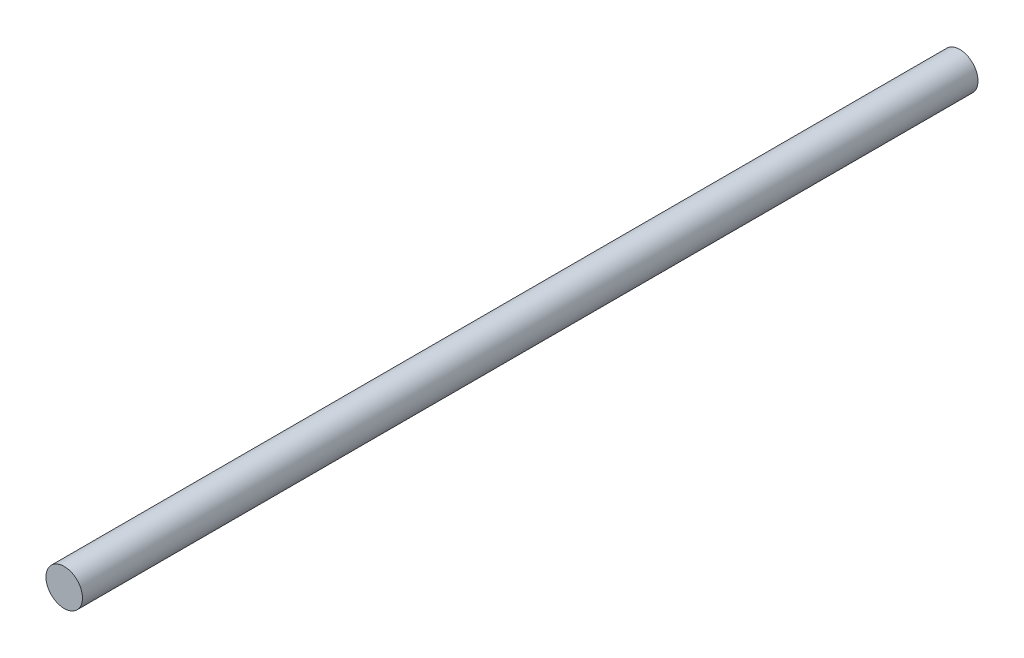
ISO-10303-21;
HEADER;
FILE_DESCRIPTION(('STEP AP214'),'2;1');
FILE_NAME('part.step','',(''),(''),'','','');
FILE_SCHEMA(('AUTOMOTIVE_DESIGN { 1 0 10303 214 1 1 1 1 }'));
ENDSEC;
DATA;
#1=APPLICATION_CONTEXT('core data for automotive mechanical design processes');
#2=APPLICATION_PROTOCOL_DEFINITION('international standard','automotive_design',2000,#1);
#3=PRODUCT_CONTEXT('',#1,'mechanical');
#4=PRODUCT('Part','Part','',(#3));
#5=PRODUCT_RELATED_PRODUCT_CATEGORY('part','',(#4));
#6=PRODUCT_DEFINITION_FORMATION('','',#4);
#7=PRODUCT_DEFINITION_CONTEXT('part definition',#1,'design');
#8=PRODUCT_DEFINITION('design','',#6,#7);
#9=PRODUCT_DEFINITION_SHAPE('','',#8);
#10=(LENGTH_UNIT() NAMED_UNIT(*) SI_UNIT(.MILLI.,.METRE.));
#11=(NAMED_UNIT(*) PLANE_ANGLE_UNIT() SI_UNIT($,.RADIAN.));
#12=(NAMED_UNIT(*) SI_UNIT($,.STERADIAN.) SOLID_ANGLE_UNIT());
#13=UNCERTAINTY_MEASURE_WITH_UNIT(LENGTH_MEASURE(1.E-05),#10,'distance_accuracy_value','');
#14=(GEOMETRIC_REPRESENTATION_CONTEXT(3) GLOBAL_UNCERTAINTY_ASSIGNED_CONTEXT((#13)) GLOBAL_UNIT_ASSIGNED_CONTEXT((#10,
#11,#12)) REPRESENTATION_CONTEXT('',''));
#15=CARTESIAN_POINT('',(0.,0.,0.));
#16=DIRECTION('',(0.,0.,1.));
#17=DIRECTION('',(1.,0.,0.));
#18=AXIS2_PLACEMENT_3D('',#15,#16,#17);
#19=CARTESIAN_POINT('',(0.,0.,40.));
#20=DIRECTION('',(0.,0.,-1.));
#21=DIRECTION('',(-1.,0.,0.));
#22=AXIS2_PLACEMENT_3D('',#19,#20,#21);
#23=CYLINDRICAL_SURFACE('',#22,0.815);
#24=CARTESIAN_POINT('',(0.,0.,40.));
#25=DIRECTION('',(0.,0.,1.));
#26=DIRECTION('',(1.,0.,0.));
#27=AXIS2_PLACEMENT_3D('',#24,#25,#26);
#28=CIRCLE('',#27,0.815);
#29=CARTESIAN_POINT('',(0.815,0.,40.));
#30=VERTEX_POINT('',#29);
#31=EDGE_CURVE('E10',#30,#30,#28,.T.);
#32=ORIENTED_EDGE('',*,*,#31,.F.);
#33=EDGE_LOOP('',(#32));
#34=FACE_BOUND('',#33,.T.);
#35=CARTESIAN_POINT('',(0.,0.,0.));
#36=DIRECTION('',(0.,0.,1.));
#37=DIRECTION('',(1.,0.,0.));
#38=AXIS2_PLACEMENT_3D('',#35,#36,#37);
#39=CIRCLE('',#38,0.815);
#40=CARTESIAN_POINT('',(0.815,0.,0.));
#41=VERTEX_POINT('',#40);
#42=EDGE_CURVE('E40',#41,#41,#39,.T.);
#43=ORIENTED_EDGE('',*,*,#42,.T.);
#44=EDGE_LOOP('',(#43));
#45=FACE_BOUND('',#44,.T.);
#46=ADVANCED_FACE('F37',(#34,#45),#23,.T.);
#47=CARTESIAN_POINT('',(0.,0.,40.));
#48=DIRECTION('',(0.,0.,1.));
#49=DIRECTION('',(1.,0.,0.));
#50=AXIS2_PLACEMENT_3D('',#47,#48,#49);
#51=PLANE('',#50);
#52=ORIENTED_EDGE('',*,*,#31,.T.);
#53=EDGE_LOOP('',(#52));
#54=FACE_BOUND('',#53,.T.);
#55=ADVANCED_FACE('F52',(#54),#51,.T.);
#56=CARTESIAN_POINT('',(0.,0.,0.));
#57=DIRECTION('',(0.,0.,1.));
#58=DIRECTION('',(1.,0.,0.));
#59=AXIS2_PLACEMENT_3D('',#56,#57,#58);
#60=PLANE('',#59);
#61=ORIENTED_EDGE('',*,*,#42,.F.);
#62=EDGE_LOOP('',(#61));
#63=FACE_BOUND('',#62,.T.);
#64=ADVANCED_FACE('F50',(#63),#60,.F.);
#65=CLOSED_SHELL('',(#46,#55,#64));
#66=MANIFOLD_SOLID_BREP('B2',#65);
#67=ADVANCED_BREP_SHAPE_REPRESENTATION('',(#18,#66),#14);
#68=SHAPE_DEFINITION_REPRESENTATION(#9,#67);
ENDSEC;
END-ISO-10303-21;
